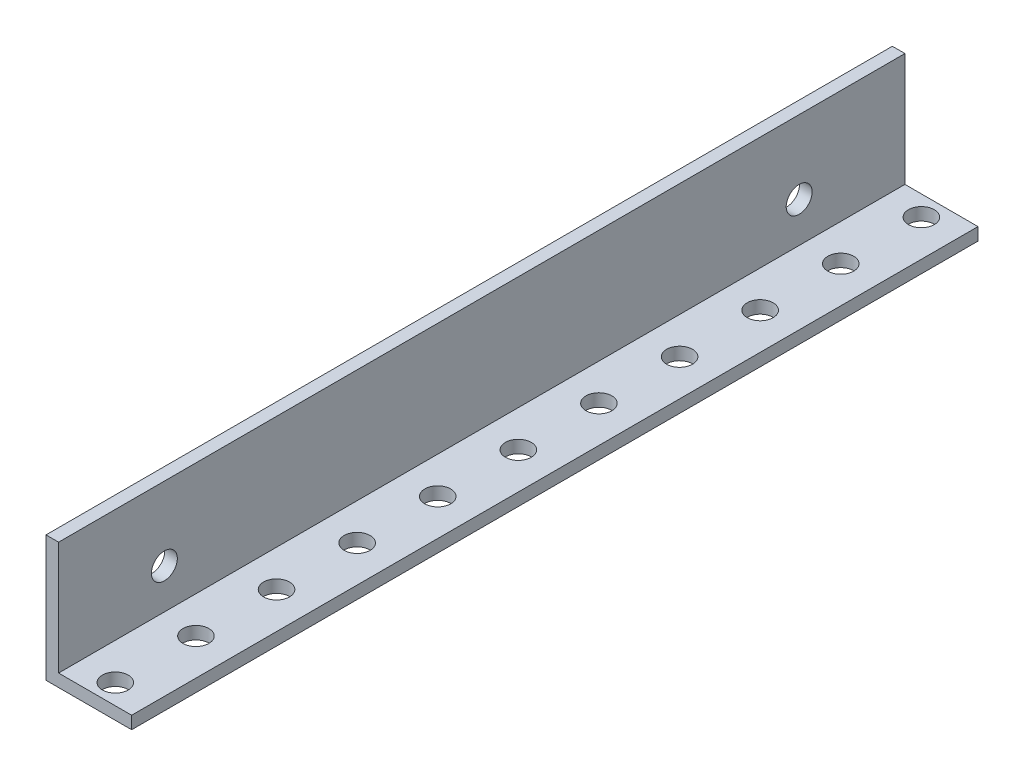
ISO-10303-21;
HEADER;
FILE_DESCRIPTION(('STEP AP214'),'2;1');
FILE_NAME('part.step','',(''),(''),'','','');
FILE_SCHEMA(('AUTOMOTIVE_DESIGN { 1 0 10303 214 1 1 1 1 }'));
ENDSEC;
DATA;
#1=APPLICATION_CONTEXT('core data for automotive mechanical design processes');
#2=APPLICATION_PROTOCOL_DEFINITION('international standard','automotive_design',2000,#1);
#3=PRODUCT_CONTEXT('',#1,'mechanical');
#4=PRODUCT('Part','Part','',(#3));
#5=PRODUCT_RELATED_PRODUCT_CATEGORY('part','',(#4));
#6=PRODUCT_DEFINITION_FORMATION('','',#4);
#7=PRODUCT_DEFINITION_CONTEXT('part definition',#1,'design');
#8=PRODUCT_DEFINITION('design','',#6,#7);
#9=PRODUCT_DEFINITION_SHAPE('','',#8);
#10=(LENGTH_UNIT() NAMED_UNIT(*) SI_UNIT(.MILLI.,.METRE.));
#11=(NAMED_UNIT(*) PLANE_ANGLE_UNIT() SI_UNIT($,.RADIAN.));
#12=(NAMED_UNIT(*) SI_UNIT($,.STERADIAN.) SOLID_ANGLE_UNIT());
#13=UNCERTAINTY_MEASURE_WITH_UNIT(LENGTH_MEASURE(1.E-05),#10,'distance_accuracy_value','');
#14=(GEOMETRIC_REPRESENTATION_CONTEXT(3) GLOBAL_UNCERTAINTY_ASSIGNED_CONTEXT((#13)) GLOBAL_UNIT_ASSIGNED_CONTEXT((#10,
#11,#12)) REPRESENTATION_CONTEXT('',''));
#15=CARTESIAN_POINT('',(0.,0.,0.));
#16=DIRECTION('',(0.,0.,1.));
#17=DIRECTION('',(1.,0.,0.));
#18=AXIS2_PLACEMENT_3D('',#15,#16,#17);
#19=CARTESIAN_POINT('',(1.5875,1.5875,53.34));
#20=DIRECTION('',(0.,-1.,0.));
#21=DIRECTION('',(1.,0.,0.));
#22=AXIS2_PLACEMENT_3D('',#19,#20,#21);
#23=PLANE('',#22);
#24=CARTESIAN_POINT('',(6.1976,1.5875,50.8));
#25=DIRECTION('',(0.,1.,0.));
#26=DIRECTION('',(0.,0.,1.));
#27=AXIS2_PLACEMENT_3D('',#24,#25,#26);
#28=CIRCLE('',#27,1.63194999999999);
#29=CARTESIAN_POINT('',(6.1976,1.5875,52.43195));
#30=VERTEX_POINT('',#29);
#31=EDGE_CURVE('E189',#30,#30,#28,.T.);
#32=ORIENTED_EDGE('',*,*,#31,.F.);
#33=EDGE_LOOP('',(#32));
#34=FACE_BOUND('',#33,.T.);
#35=CARTESIAN_POINT('',(6.1976,1.5875,40.64));
#36=DIRECTION('',(0.,1.,0.));
#37=DIRECTION('',(0.,0.,1.));
#38=AXIS2_PLACEMENT_3D('',#35,#36,#37);
#39=CIRCLE('',#38,1.63194999999999);
#40=CARTESIAN_POINT('',(6.1976,1.5875,42.27195));
#41=VERTEX_POINT('',#40);
#42=EDGE_CURVE('E199',#41,#41,#39,.T.);
#43=ORIENTED_EDGE('',*,*,#42,.F.);
#44=EDGE_LOOP('',(#43));
#45=FACE_BOUND('',#44,.T.);
#46=CARTESIAN_POINT('',(6.1976,1.5875,30.48));
#47=DIRECTION('',(0.,1.,0.));
#48=DIRECTION('',(0.,0.,1.));
#49=AXIS2_PLACEMENT_3D('',#46,#47,#48);
#50=CIRCLE('',#49,1.63194999999999);
#51=CARTESIAN_POINT('',(6.1976,1.5875,32.11195));
#52=VERTEX_POINT('',#51);
#53=EDGE_CURVE('E205',#52,#52,#50,.T.);
#54=ORIENTED_EDGE('',*,*,#53,.F.);
#55=EDGE_LOOP('',(#54));
#56=FACE_BOUND('',#55,.T.);
#57=CARTESIAN_POINT('',(6.1976,1.5875,20.32));
#58=DIRECTION('',(0.,1.,0.));
#59=DIRECTION('',(0.,0.,1.));
#60=AXIS2_PLACEMENT_3D('',#57,#58,#59);
#61=CIRCLE('',#60,1.63194999999999);
#62=CARTESIAN_POINT('',(6.1976,1.5875,21.95195));
#63=VERTEX_POINT('',#62);
#64=EDGE_CURVE('E211',#63,#63,#61,.T.);
#65=ORIENTED_EDGE('',*,*,#64,.F.);
#66=EDGE_LOOP('',(#65));
#67=FACE_BOUND('',#66,.T.);
#68=CARTESIAN_POINT('',(6.1976,1.5875,10.16));
#69=DIRECTION('',(0.,1.,0.));
#70=DIRECTION('',(0.,0.,1.));
#71=AXIS2_PLACEMENT_3D('',#68,#69,#70);
#72=CIRCLE('',#71,1.63194999999999);
#73=CARTESIAN_POINT('',(6.1976,1.5875,11.79195));
#74=VERTEX_POINT('',#73);
#75=EDGE_CURVE('E217',#74,#74,#72,.T.);
#76=ORIENTED_EDGE('',*,*,#75,.F.);
#77=EDGE_LOOP('',(#76));
#78=FACE_BOUND('',#77,.T.);
#79=CARTESIAN_POINT('',(6.1976,1.5875,-50.8));
#80=DIRECTION('',(0.,1.,0.));
#81=DIRECTION('',(0.,0.,1.));
#82=AXIS2_PLACEMENT_3D('',#79,#80,#81);
#83=CIRCLE('',#82,1.63194999999999);
#84=CARTESIAN_POINT('',(6.1976,1.5875,-49.16805));
#85=VERTEX_POINT('',#84);
#86=EDGE_CURVE('E223',#85,#85,#83,.T.);
#87=ORIENTED_EDGE('',*,*,#86,.F.);
#88=EDGE_LOOP('',(#87));
#89=FACE_BOUND('',#88,.T.);
#90=CARTESIAN_POINT('',(6.1976,1.5875,-40.64));
#91=DIRECTION('',(0.,1.,0.));
#92=DIRECTION('',(0.,0.,1.));
#93=AXIS2_PLACEMENT_3D('',#90,#91,#92);
#94=CIRCLE('',#93,1.63194999999999);
#95=CARTESIAN_POINT('',(6.1976,1.5875,-39.00805));
#96=VERTEX_POINT('',#95);
#97=EDGE_CURVE('E229',#96,#96,#94,.T.);
#98=ORIENTED_EDGE('',*,*,#97,.F.);
#99=EDGE_LOOP('',(#98));
#100=FACE_BOUND('',#99,.T.);
#101=DIRECTION('',(-1.,0.,0.));
#102=VECTOR('',#101,1.);
#103=CARTESIAN_POINT('',(1.5875,1.5875,-53.34));
#104=LINE('',#103,#102);
#105=CARTESIAN_POINT('',(10.795,1.5875,-53.34));
#106=VERTEX_POINT('',#105);
#107=CARTESIAN_POINT('',(1.5875,1.5875,-53.34));
#108=VERTEX_POINT('',#107);
#109=EDGE_CURVE('E128',#106,#108,#104,.T.);
#110=ORIENTED_EDGE('',*,*,#109,.T.);
#111=DIRECTION('',(0.,0.,-1.));
#112=VECTOR('',#111,1.);
#113=CARTESIAN_POINT('',(1.5875,1.5875,53.34));
#114=LINE('',#113,#112);
#115=CARTESIAN_POINT('',(1.5875,1.5875,53.34));
#116=VERTEX_POINT('',#115);
#117=EDGE_CURVE('E113',#116,#108,#114,.T.);
#118=ORIENTED_EDGE('',*,*,#117,.F.);
#119=DIRECTION('',(-1.,0.,0.));
#120=VECTOR('',#119,1.);
#121=CARTESIAN_POINT('',(1.5875,1.5875,53.34));
#122=LINE('',#121,#120);
#123=CARTESIAN_POINT('',(10.795,1.5875,53.34));
#124=VERTEX_POINT('',#123);
#125=EDGE_CURVE('E104',#124,#116,#122,.T.);
#126=ORIENTED_EDGE('',*,*,#125,.F.);
#127=DIRECTION('',(0.,0.,-1.));
#128=VECTOR('',#127,1.);
#129=CARTESIAN_POINT('',(10.795,1.5875,53.34));
#130=LINE('',#129,#128);
#131=EDGE_CURVE('E46',#124,#106,#130,.T.);
#132=ORIENTED_EDGE('',*,*,#131,.T.);
#133=EDGE_LOOP('',(#110,#118,#126,#132));
#134=FACE_BOUND('',#133,.T.);
#135=CARTESIAN_POINT('',(6.1976,1.5875,0.));
#136=DIRECTION('',(0.,1.,0.));
#137=DIRECTION('',(0.,0.,1.));
#138=AXIS2_PLACEMENT_3D('',#135,#136,#137);
#139=CIRCLE('',#138,1.63194999999999);
#140=CARTESIAN_POINT('',(6.1976,1.5875,1.63194999999999));
#141=VERTEX_POINT('',#140);
#142=EDGE_CURVE('E253',#141,#141,#139,.T.);
#143=ORIENTED_EDGE('',*,*,#142,.F.);
#144=EDGE_LOOP('',(#143));
#145=FACE_BOUND('',#144,.T.);
#146=CARTESIAN_POINT('',(6.1976,1.5875,-10.16));
#147=DIRECTION('',(0.,1.,0.));
#148=DIRECTION('',(0.,0.,1.));
#149=AXIS2_PLACEMENT_3D('',#146,#147,#148);
#150=CIRCLE('',#149,1.63194999999999);
#151=CARTESIAN_POINT('',(6.1976,1.5875,-8.52805000000001));
#152=VERTEX_POINT('',#151);
#153=EDGE_CURVE('E247',#152,#152,#150,.T.);
#154=ORIENTED_EDGE('',*,*,#153,.F.);
#155=EDGE_LOOP('',(#154));
#156=FACE_BOUND('',#155,.T.);
#157=CARTESIAN_POINT('',(6.1976,1.5875,-20.32));
#158=DIRECTION('',(0.,1.,0.));
#159=DIRECTION('',(0.,0.,1.));
#160=AXIS2_PLACEMENT_3D('',#157,#158,#159);
#161=CIRCLE('',#160,1.63194999999999);
#162=CARTESIAN_POINT('',(6.1976,1.5875,-18.68805));
#163=VERTEX_POINT('',#162);
#164=EDGE_CURVE('E241',#163,#163,#161,.T.);
#165=ORIENTED_EDGE('',*,*,#164,.F.);
#166=EDGE_LOOP('',(#165));
#167=FACE_BOUND('',#166,.T.);
#168=CARTESIAN_POINT('',(6.1976,1.5875,-30.48));
#169=DIRECTION('',(0.,1.,0.));
#170=DIRECTION('',(0.,0.,1.));
#171=AXIS2_PLACEMENT_3D('',#168,#169,#170);
#172=CIRCLE('',#171,1.63194999999999);
#173=CARTESIAN_POINT('',(6.1976,1.5875,-28.84805));
#174=VERTEX_POINT('',#173);
#175=EDGE_CURVE('E235',#174,#174,#172,.T.);
#176=ORIENTED_EDGE('',*,*,#175,.F.);
#177=EDGE_LOOP('',(#176));
#178=FACE_BOUND('',#177,.T.);
#179=ADVANCED_FACE('F37',(#34,#45,#56,#67,#78,#89,#100,#134,#145,#156,#167,#178),#23,.F.);
#180=CARTESIAN_POINT('',(10.795,0.,53.34));
#181=DIRECTION('',(0.,1.,0.));
#182=DIRECTION('',(-1.,0.,0.));
#183=AXIS2_PLACEMENT_3D('',#180,#181,#182);
#184=PLANE('',#183);
#185=CARTESIAN_POINT('',(6.1976,0.,50.8));
#186=DIRECTION('',(0.,1.,0.));
#187=DIRECTION('',(-1.,0.,0.));
#188=AXIS2_PLACEMENT_3D('',#185,#186,#187);
#189=CIRCLE('',#188,1.63194999999999);
#190=CARTESIAN_POINT('',(4.56565000000001,0.,50.8));
#191=VERTEX_POINT('',#190);
#192=EDGE_CURVE('E196',#191,#191,#189,.T.);
#193=ORIENTED_EDGE('',*,*,#192,.T.);
#194=EDGE_LOOP('',(#193));
#195=FACE_BOUND('',#194,.T.);
#196=CARTESIAN_POINT('',(6.1976,0.,40.64));
#197=DIRECTION('',(0.,1.,0.));
#198=DIRECTION('',(-1.,0.,0.));
#199=AXIS2_PLACEMENT_3D('',#196,#197,#198);
#200=CIRCLE('',#199,1.63194999999999);
#201=CARTESIAN_POINT('',(4.56565000000001,0.,40.64));
#202=VERTEX_POINT('',#201);
#203=EDGE_CURVE('E202',#202,#202,#200,.T.);
#204=ORIENTED_EDGE('',*,*,#203,.T.);
#205=EDGE_LOOP('',(#204));
#206=FACE_BOUND('',#205,.T.);
#207=CARTESIAN_POINT('',(6.1976,0.,30.48));
#208=DIRECTION('',(0.,1.,0.));
#209=DIRECTION('',(-1.,0.,0.));
#210=AXIS2_PLACEMENT_3D('',#207,#208,#209);
#211=CIRCLE('',#210,1.63194999999999);
#212=CARTESIAN_POINT('',(4.56565000000001,0.,30.48));
#213=VERTEX_POINT('',#212);
#214=EDGE_CURVE('E208',#213,#213,#211,.T.);
#215=ORIENTED_EDGE('',*,*,#214,.T.);
#216=EDGE_LOOP('',(#215));
#217=FACE_BOUND('',#216,.T.);
#218=CARTESIAN_POINT('',(6.1976,0.,20.32));
#219=DIRECTION('',(0.,1.,0.));
#220=DIRECTION('',(-1.,0.,0.));
#221=AXIS2_PLACEMENT_3D('',#218,#219,#220);
#222=CIRCLE('',#221,1.63194999999999);
#223=CARTESIAN_POINT('',(4.56565000000001,0.,20.32));
#224=VERTEX_POINT('',#223);
#225=EDGE_CURVE('E214',#224,#224,#222,.T.);
#226=ORIENTED_EDGE('',*,*,#225,.T.);
#227=EDGE_LOOP('',(#226));
#228=FACE_BOUND('',#227,.T.);
#229=CARTESIAN_POINT('',(6.1976,0.,10.16));
#230=DIRECTION('',(0.,1.,0.));
#231=DIRECTION('',(-1.,0.,0.));
#232=AXIS2_PLACEMENT_3D('',#229,#230,#231);
#233=CIRCLE('',#232,1.63194999999999);
#234=CARTESIAN_POINT('',(4.56565000000001,0.,10.16));
#235=VERTEX_POINT('',#234);
#236=EDGE_CURVE('E220',#235,#235,#233,.T.);
#237=ORIENTED_EDGE('',*,*,#236,.T.);
#238=EDGE_LOOP('',(#237));
#239=FACE_BOUND('',#238,.T.);
#240=CARTESIAN_POINT('',(6.1976,0.,-50.8));
#241=DIRECTION('',(0.,1.,0.));
#242=DIRECTION('',(-1.,0.,0.));
#243=AXIS2_PLACEMENT_3D('',#240,#241,#242);
#244=CIRCLE('',#243,1.63194999999999);
#245=CARTESIAN_POINT('',(4.56565000000001,0.,-50.8));
#246=VERTEX_POINT('',#245);
#247=EDGE_CURVE('E226',#246,#246,#244,.T.);
#248=ORIENTED_EDGE('',*,*,#247,.T.);
#249=EDGE_LOOP('',(#248));
#250=FACE_BOUND('',#249,.T.);
#251=CARTESIAN_POINT('',(6.1976,0.,-40.64));
#252=DIRECTION('',(0.,1.,0.));
#253=DIRECTION('',(-1.,0.,0.));
#254=AXIS2_PLACEMENT_3D('',#251,#252,#253);
#255=CIRCLE('',#254,1.63194999999999);
#256=CARTESIAN_POINT('',(4.56565000000001,0.,-40.64));
#257=VERTEX_POINT('',#256);
#258=EDGE_CURVE('E232',#257,#257,#255,.T.);
#259=ORIENTED_EDGE('',*,*,#258,.T.);
#260=EDGE_LOOP('',(#259));
#261=FACE_BOUND('',#260,.T.);
#262=CARTESIAN_POINT('',(6.1976,0.,-30.48));
#263=DIRECTION('',(0.,1.,0.));
#264=DIRECTION('',(-1.,0.,0.));
#265=AXIS2_PLACEMENT_3D('',#262,#263,#264);
#266=CIRCLE('',#265,1.63194999999999);
#267=CARTESIAN_POINT('',(4.56565000000001,0.,-30.48));
#268=VERTEX_POINT('',#267);
#269=EDGE_CURVE('E238',#268,#268,#266,.T.);
#270=ORIENTED_EDGE('',*,*,#269,.T.);
#271=EDGE_LOOP('',(#270));
#272=FACE_BOUND('',#271,.T.);
#273=CARTESIAN_POINT('',(6.1976,0.,-20.32));
#274=DIRECTION('',(0.,1.,0.));
#275=DIRECTION('',(-1.,0.,0.));
#276=AXIS2_PLACEMENT_3D('',#273,#274,#275);
#277=CIRCLE('',#276,1.63194999999999);
#278=CARTESIAN_POINT('',(4.56565000000001,0.,-20.32));
#279=VERTEX_POINT('',#278);
#280=EDGE_CURVE('E244',#279,#279,#277,.T.);
#281=ORIENTED_EDGE('',*,*,#280,.T.);
#282=EDGE_LOOP('',(#281));
#283=FACE_BOUND('',#282,.T.);
#284=CARTESIAN_POINT('',(6.1976,0.,-10.16));
#285=DIRECTION('',(0.,1.,0.));
#286=DIRECTION('',(-1.,0.,0.));
#287=AXIS2_PLACEMENT_3D('',#284,#285,#286);
#288=CIRCLE('',#287,1.63194999999999);
#289=CARTESIAN_POINT('',(4.56565000000001,0.,-10.16));
#290=VERTEX_POINT('',#289);
#291=EDGE_CURVE('E250',#290,#290,#288,.T.);
#292=ORIENTED_EDGE('',*,*,#291,.T.);
#293=EDGE_LOOP('',(#292));
#294=FACE_BOUND('',#293,.T.);
#295=CARTESIAN_POINT('',(6.1976,0.,0.));
#296=DIRECTION('',(0.,1.,0.));
#297=DIRECTION('',(-1.,0.,0.));
#298=AXIS2_PLACEMENT_3D('',#295,#296,#297);
#299=CIRCLE('',#298,1.63194999999999);
#300=CARTESIAN_POINT('',(4.56565000000001,0.,0.));
#301=VERTEX_POINT('',#300);
#302=EDGE_CURVE('E126',#301,#301,#299,.T.);
#303=ORIENTED_EDGE('',*,*,#302,.T.);
#304=EDGE_LOOP('',(#303));
#305=FACE_BOUND('',#304,.T.);
#306=DIRECTION('',(1.,0.,0.));
#307=VECTOR('',#306,1.);
#308=CARTESIAN_POINT('',(10.795,0.,-53.34));
#309=LINE('',#308,#307);
#310=CARTESIAN_POINT('',(0.,0.,-53.34));
#311=VERTEX_POINT('',#310);
#312=CARTESIAN_POINT('',(10.795,0.,-53.34));
#313=VERTEX_POINT('',#312);
#314=EDGE_CURVE('E122',#311,#313,#309,.T.);
#315=ORIENTED_EDGE('',*,*,#314,.T.);
#316=DIRECTION('',(0.,0.,-1.));
#317=VECTOR('',#316,1.);
#318=CARTESIAN_POINT('',(10.795,0.,53.34));
#319=LINE('',#318,#317);
#320=CARTESIAN_POINT('',(10.795,0.,53.34));
#321=VERTEX_POINT('',#320);
#322=EDGE_CURVE('E11',#321,#313,#319,.T.);
#323=ORIENTED_EDGE('',*,*,#322,.F.);
#324=DIRECTION('',(1.,0.,0.));
#325=VECTOR('',#324,1.);
#326=CARTESIAN_POINT('',(10.795,0.,53.34));
#327=LINE('',#326,#325);
#328=CARTESIAN_POINT('',(0.,0.,53.34));
#329=VERTEX_POINT('',#328);
#330=EDGE_CURVE('E133',#329,#321,#327,.T.);
#331=ORIENTED_EDGE('',*,*,#330,.F.);
#332=DIRECTION('',(0.,0.,-1.));
#333=VECTOR('',#332,1.);
#334=CARTESIAN_POINT('',(0.,0.,53.34));
#335=LINE('',#334,#333);
#336=EDGE_CURVE('E118',#329,#311,#335,.T.);
#337=ORIENTED_EDGE('',*,*,#336,.T.);
#338=EDGE_LOOP('',(#315,#323,#331,#337));
#339=FACE_BOUND('',#338,.T.);
#340=ADVANCED_FACE('F39',(#195,#206,#217,#228,#239,#250,#261,#272,#283,#294,#305,#339),#184,.F.);
#341=CARTESIAN_POINT('',(10.795,1.5875,53.34));
#342=DIRECTION('',(-1.,0.,0.));
#343=DIRECTION('',(0.,0.,1.));
#344=AXIS2_PLACEMENT_3D('',#341,#342,#343);
#345=PLANE('',#344);
#346=DIRECTION('',(0.,1.,0.));
#347=VECTOR('',#346,1.);
#348=CARTESIAN_POINT('',(10.795,1.5875,-53.34));
#349=LINE('',#348,#347);
#350=EDGE_CURVE('E125',#313,#106,#349,.T.);
#351=ORIENTED_EDGE('',*,*,#350,.T.);
#352=ORIENTED_EDGE('',*,*,#131,.F.);
#353=DIRECTION('',(0.,1.,0.));
#354=VECTOR('',#353,1.);
#355=CARTESIAN_POINT('',(10.795,1.5875,53.34));
#356=LINE('',#355,#354);
#357=EDGE_CURVE('E91',#321,#124,#356,.T.);
#358=ORIENTED_EDGE('',*,*,#357,.F.);
#359=ORIENTED_EDGE('',*,*,#322,.T.);
#360=EDGE_LOOP('',(#351,#352,#358,#359));
#361=FACE_BOUND('',#360,.T.);
#362=ADVANCED_FACE('F165',(#361),#345,.F.);
#363=CARTESIAN_POINT('',(1.5875,15.875,53.34));
#364=DIRECTION('',(-1.,0.,0.));
#365=DIRECTION('',(0.,-1.,0.));
#366=AXIS2_PLACEMENT_3D('',#363,#364,#365);
#367=PLANE('',#366);
#368=CARTESIAN_POINT('',(1.5875,6.62178,-40.005));
#369=DIRECTION('',(1.,0.,0.));
#370=DIRECTION('',(0.,0.,-1.));
#371=AXIS2_PLACEMENT_3D('',#368,#369,#370);
#372=CIRCLE('',#371,1.63194999999999);
#373=CARTESIAN_POINT('',(1.5875,6.62178,-41.63695));
#374=VERTEX_POINT('',#373);
#375=EDGE_CURVE('E180',#374,#374,#372,.T.);
#376=ORIENTED_EDGE('',*,*,#375,.F.);
#377=EDGE_LOOP('',(#376));
#378=FACE_BOUND('',#377,.T.);
#379=CARTESIAN_POINT('',(1.5875,6.62177999999999,40.005));
#380=DIRECTION('',(1.,0.,0.));
#381=DIRECTION('',(0.,0.,-1.));
#382=AXIS2_PLACEMENT_3D('',#379,#380,#381);
#383=CIRCLE('',#382,1.63194999999999);
#384=CARTESIAN_POINT('',(1.5875,6.62177999999999,38.37305));
#385=VERTEX_POINT('',#384);
#386=EDGE_CURVE('E183',#385,#385,#383,.T.);
#387=ORIENTED_EDGE('',*,*,#386,.F.);
#388=EDGE_LOOP('',(#387));
#389=FACE_BOUND('',#388,.T.);
#390=DIRECTION('',(0.,1.,0.));
#391=VECTOR('',#390,1.);
#392=CARTESIAN_POINT('',(1.5875,15.875,-53.34));
#393=LINE('',#392,#391);
#394=CARTESIAN_POINT('',(1.5875,15.875,-53.34));
#395=VERTEX_POINT('',#394);
#396=EDGE_CURVE('E112',#108,#395,#393,.T.);
#397=ORIENTED_EDGE('',*,*,#396,.T.);
#398=DIRECTION('',(0.,0.,-1.));
#399=VECTOR('',#398,1.);
#400=CARTESIAN_POINT('',(1.5875,15.875,53.34));
#401=LINE('',#400,#399);
#402=CARTESIAN_POINT('',(1.5875,15.875,53.34));
#403=VERTEX_POINT('',#402);
#404=EDGE_CURVE('E109',#403,#395,#401,.T.);
#405=ORIENTED_EDGE('',*,*,#404,.F.);
#406=DIRECTION('',(0.,1.,0.));
#407=VECTOR('',#406,1.);
#408=CARTESIAN_POINT('',(1.5875,15.875,53.34));
#409=LINE('',#408,#407);
#410=EDGE_CURVE('E98',#116,#403,#409,.T.);
#411=ORIENTED_EDGE('',*,*,#410,.F.);
#412=ORIENTED_EDGE('',*,*,#117,.T.);
#413=EDGE_LOOP('',(#397,#405,#411,#412));
#414=FACE_BOUND('',#413,.T.);
#415=ADVANCED_FACE('F110',(#378,#389,#414),#367,.F.);
#416=CARTESIAN_POINT('',(0.,15.875,53.34));
#417=DIRECTION('',(0.,-1.,0.));
#418=DIRECTION('',(0.,0.,-1.));
#419=AXIS2_PLACEMENT_3D('',#416,#417,#418);
#420=PLANE('',#419);
#421=DIRECTION('',(-1.,0.,0.));
#422=VECTOR('',#421,1.);
#423=CARTESIAN_POINT('',(0.,15.875,-53.34));
#424=LINE('',#423,#422);
#425=CARTESIAN_POINT('',(0.,15.875,-53.34));
#426=VERTEX_POINT('',#425);
#427=EDGE_CURVE('E77',#395,#426,#424,.T.);
#428=ORIENTED_EDGE('',*,*,#427,.T.);
#429=DIRECTION('',(0.,0.,-1.));
#430=VECTOR('',#429,1.);
#431=CARTESIAN_POINT('',(0.,15.875,53.34));
#432=LINE('',#431,#430);
#433=CARTESIAN_POINT('',(0.,15.875,53.34));
#434=VERTEX_POINT('',#433);
#435=EDGE_CURVE('E114',#434,#426,#432,.T.);
#436=ORIENTED_EDGE('',*,*,#435,.F.);
#437=DIRECTION('',(-1.,0.,0.));
#438=VECTOR('',#437,1.);
#439=CARTESIAN_POINT('',(0.,15.875,53.34));
#440=LINE('',#439,#438);
#441=EDGE_CURVE('E102',#403,#434,#440,.T.);
#442=ORIENTED_EDGE('',*,*,#441,.F.);
#443=ORIENTED_EDGE('',*,*,#404,.T.);
#444=EDGE_LOOP('',(#428,#436,#442,#443));
#445=FACE_BOUND('',#444,.T.);
#446=ADVANCED_FACE('F116',(#445),#420,.F.);
#447=CARTESIAN_POINT('',(0.,0.,53.34));
#448=DIRECTION('',(1.,0.,0.));
#449=DIRECTION('',(0.,0.,-1.));
#450=AXIS2_PLACEMENT_3D('',#447,#448,#449);
#451=PLANE('',#450);
#452=CARTESIAN_POINT('',(0.,6.62178,-40.005));
#453=DIRECTION('',(1.,0.,0.));
#454=DIRECTION('',(0.,0.,-1.));
#455=AXIS2_PLACEMENT_3D('',#452,#453,#454);
#456=CIRCLE('',#455,1.63194999999999);
#457=CARTESIAN_POINT('',(0.,6.62178,-41.63695));
#458=VERTEX_POINT('',#457);
#459=EDGE_CURVE('E186',#458,#458,#456,.T.);
#460=ORIENTED_EDGE('',*,*,#459,.T.);
#461=EDGE_LOOP('',(#460));
#462=FACE_BOUND('',#461,.T.);
#463=CARTESIAN_POINT('',(0.,6.62177999999999,40.005));
#464=DIRECTION('',(1.,0.,0.));
#465=DIRECTION('',(0.,0.,-1.));
#466=AXIS2_PLACEMENT_3D('',#463,#464,#465);
#467=CIRCLE('',#466,1.63194999999999);
#468=CARTESIAN_POINT('',(0.,6.62177999999999,38.37305));
#469=VERTEX_POINT('',#468);
#470=EDGE_CURVE('E185',#469,#469,#467,.T.);
#471=ORIENTED_EDGE('',*,*,#470,.T.);
#472=EDGE_LOOP('',(#471));
#473=FACE_BOUND('',#472,.T.);
#474=DIRECTION('',(0.,-1.,0.));
#475=VECTOR('',#474,1.);
#476=CARTESIAN_POINT('',(0.,0.,-53.34));
#477=LINE('',#476,#475);
#478=EDGE_CURVE('E83',#426,#311,#477,.T.);
#479=ORIENTED_EDGE('',*,*,#478,.T.);
#480=ORIENTED_EDGE('',*,*,#336,.F.);
#481=DIRECTION('',(0.,-1.,0.));
#482=VECTOR('',#481,1.);
#483=CARTESIAN_POINT('',(0.,0.,53.34));
#484=LINE('',#483,#482);
#485=EDGE_CURVE('E54',#434,#329,#484,.T.);
#486=ORIENTED_EDGE('',*,*,#485,.F.);
#487=ORIENTED_EDGE('',*,*,#435,.T.);
#488=EDGE_LOOP('',(#479,#480,#486,#487));
#489=FACE_BOUND('',#488,.T.);
#490=ADVANCED_FACE('F146',(#462,#473,#489),#451,.F.);
#491=CARTESIAN_POINT('',(0.,0.,53.34));
#492=DIRECTION('',(0.,0.,-1.));
#493=DIRECTION('',(-1.,0.,0.));
#494=AXIS2_PLACEMENT_3D('',#491,#492,#493);
#495=PLANE('',#494);
#496=ORIENTED_EDGE('',*,*,#330,.T.);
#497=ORIENTED_EDGE('',*,*,#357,.T.);
#498=ORIENTED_EDGE('',*,*,#125,.T.);
#499=ORIENTED_EDGE('',*,*,#410,.T.);
#500=ORIENTED_EDGE('',*,*,#441,.T.);
#501=ORIENTED_EDGE('',*,*,#485,.T.);
#502=EDGE_LOOP('',(#496,#497,#498,#499,#500,#501));
#503=FACE_BOUND('',#502,.T.);
#504=ADVANCED_FACE('F100',(#503),#495,.F.);
#505=CARTESIAN_POINT('',(0.,0.,-53.34));
#506=DIRECTION('',(0.,0.,-1.));
#507=DIRECTION('',(-1.,0.,0.));
#508=AXIS2_PLACEMENT_3D('',#505,#506,#507);
#509=PLANE('',#508);
#510=ORIENTED_EDGE('',*,*,#314,.F.);
#511=ORIENTED_EDGE('',*,*,#478,.F.);
#512=ORIENTED_EDGE('',*,*,#427,.F.);
#513=ORIENTED_EDGE('',*,*,#396,.F.);
#514=ORIENTED_EDGE('',*,*,#109,.F.);
#515=ORIENTED_EDGE('',*,*,#350,.F.);
#516=EDGE_LOOP('',(#510,#511,#512,#513,#514,#515));
#517=FACE_BOUND('',#516,.T.);
#518=ADVANCED_FACE('F142',(#517),#509,.T.);
#519=CARTESIAN_POINT('',(6.1976,1.5875,0.));
#520=DIRECTION('',(0.,1.,0.));
#521=DIRECTION('',(0.,0.,1.));
#522=AXIS2_PLACEMENT_3D('',#519,#520,#521);
#523=CYLINDRICAL_SURFACE('',#522,1.63194999999999);
#524=ORIENTED_EDGE('',*,*,#142,.T.);
#525=EDGE_LOOP('',(#524));
#526=FACE_BOUND('',#525,.T.);
#527=ORIENTED_EDGE('',*,*,#302,.F.);
#528=EDGE_LOOP('',(#527));
#529=FACE_BOUND('',#528,.T.);
#530=ADVANCED_FACE('F262',(#526,#529),#523,.F.);
#531=CARTESIAN_POINT('',(6.1976,1.5875,-10.16));
#532=DIRECTION('',(0.,1.,0.));
#533=DIRECTION('',(0.,0.,1.));
#534=AXIS2_PLACEMENT_3D('',#531,#532,#533);
#535=CYLINDRICAL_SURFACE('',#534,1.63194999999999);
#536=ORIENTED_EDGE('',*,*,#153,.T.);
#537=EDGE_LOOP('',(#536));
#538=FACE_BOUND('',#537,.T.);
#539=ORIENTED_EDGE('',*,*,#291,.F.);
#540=EDGE_LOOP('',(#539));
#541=FACE_BOUND('',#540,.T.);
#542=ADVANCED_FACE('F264',(#538,#541),#535,.F.);
#543=CARTESIAN_POINT('',(6.1976,1.5875,-20.32));
#544=DIRECTION('',(0.,1.,0.));
#545=DIRECTION('',(0.,0.,1.));
#546=AXIS2_PLACEMENT_3D('',#543,#544,#545);
#547=CYLINDRICAL_SURFACE('',#546,1.63194999999999);
#548=ORIENTED_EDGE('',*,*,#164,.T.);
#549=EDGE_LOOP('',(#548));
#550=FACE_BOUND('',#549,.T.);
#551=ORIENTED_EDGE('',*,*,#280,.F.);
#552=EDGE_LOOP('',(#551));
#553=FACE_BOUND('',#552,.T.);
#554=ADVANCED_FACE('F271',(#550,#553),#547,.F.);
#555=CARTESIAN_POINT('',(6.1976,1.5875,-30.48));
#556=DIRECTION('',(0.,1.,0.));
#557=DIRECTION('',(0.,0.,1.));
#558=AXIS2_PLACEMENT_3D('',#555,#556,#557);
#559=CYLINDRICAL_SURFACE('',#558,1.63194999999999);
#560=ORIENTED_EDGE('',*,*,#175,.T.);
#561=EDGE_LOOP('',(#560));
#562=FACE_BOUND('',#561,.T.);
#563=ORIENTED_EDGE('',*,*,#269,.F.);
#564=EDGE_LOOP('',(#563));
#565=FACE_BOUND('',#564,.T.);
#566=ADVANCED_FACE('F277',(#562,#565),#559,.F.);
#567=CARTESIAN_POINT('',(6.1976,1.5875,-40.64));
#568=DIRECTION('',(0.,1.,0.));
#569=DIRECTION('',(0.,0.,1.));
#570=AXIS2_PLACEMENT_3D('',#567,#568,#569);
#571=CYLINDRICAL_SURFACE('',#570,1.63194999999999);
#572=ORIENTED_EDGE('',*,*,#97,.T.);
#573=EDGE_LOOP('',(#572));
#574=FACE_BOUND('',#573,.T.);
#575=ORIENTED_EDGE('',*,*,#258,.F.);
#576=EDGE_LOOP('',(#575));
#577=FACE_BOUND('',#576,.T.);
#578=ADVANCED_FACE('F281',(#574,#577),#571,.F.);
#579=CARTESIAN_POINT('',(6.1976,1.5875,-50.8));
#580=DIRECTION('',(0.,1.,0.));
#581=DIRECTION('',(0.,0.,1.));
#582=AXIS2_PLACEMENT_3D('',#579,#580,#581);
#583=CYLINDRICAL_SURFACE('',#582,1.63194999999999);
#584=ORIENTED_EDGE('',*,*,#86,.T.);
#585=EDGE_LOOP('',(#584));
#586=FACE_BOUND('',#585,.T.);
#587=ORIENTED_EDGE('',*,*,#247,.F.);
#588=EDGE_LOOP('',(#587));
#589=FACE_BOUND('',#588,.T.);
#590=ADVANCED_FACE('F285',(#586,#589),#583,.F.);
#591=CARTESIAN_POINT('',(6.1976,1.5875,10.16));
#592=DIRECTION('',(0.,1.,0.));
#593=DIRECTION('',(0.,0.,1.));
#594=AXIS2_PLACEMENT_3D('',#591,#592,#593);
#595=CYLINDRICAL_SURFACE('',#594,1.63194999999999);
#596=ORIENTED_EDGE('',*,*,#75,.T.);
#597=EDGE_LOOP('',(#596));
#598=FACE_BOUND('',#597,.T.);
#599=ORIENTED_EDGE('',*,*,#236,.F.);
#600=EDGE_LOOP('',(#599));
#601=FACE_BOUND('',#600,.T.);
#602=ADVANCED_FACE('F289',(#598,#601),#595,.F.);
#603=CARTESIAN_POINT('',(6.1976,1.5875,20.32));
#604=DIRECTION('',(0.,1.,0.));
#605=DIRECTION('',(0.,0.,1.));
#606=AXIS2_PLACEMENT_3D('',#603,#604,#605);
#607=CYLINDRICAL_SURFACE('',#606,1.63194999999999);
#608=ORIENTED_EDGE('',*,*,#64,.T.);
#609=EDGE_LOOP('',(#608));
#610=FACE_BOUND('',#609,.T.);
#611=ORIENTED_EDGE('',*,*,#225,.F.);
#612=EDGE_LOOP('',(#611));
#613=FACE_BOUND('',#612,.T.);
#614=ADVANCED_FACE('F293',(#610,#613),#607,.F.);
#615=CARTESIAN_POINT('',(6.1976,1.5875,30.48));
#616=DIRECTION('',(0.,1.,0.));
#617=DIRECTION('',(0.,0.,1.));
#618=AXIS2_PLACEMENT_3D('',#615,#616,#617);
#619=CYLINDRICAL_SURFACE('',#618,1.63194999999999);
#620=ORIENTED_EDGE('',*,*,#53,.T.);
#621=EDGE_LOOP('',(#620));
#622=FACE_BOUND('',#621,.T.);
#623=ORIENTED_EDGE('',*,*,#214,.F.);
#624=EDGE_LOOP('',(#623));
#625=FACE_BOUND('',#624,.T.);
#626=ADVANCED_FACE('F297',(#622,#625),#619,.F.);
#627=CARTESIAN_POINT('',(6.1976,1.5875,40.64));
#628=DIRECTION('',(0.,1.,0.));
#629=DIRECTION('',(0.,0.,1.));
#630=AXIS2_PLACEMENT_3D('',#627,#628,#629);
#631=CYLINDRICAL_SURFACE('',#630,1.63194999999999);
#632=ORIENTED_EDGE('',*,*,#42,.T.);
#633=EDGE_LOOP('',(#632));
#634=FACE_BOUND('',#633,.T.);
#635=ORIENTED_EDGE('',*,*,#203,.F.);
#636=EDGE_LOOP('',(#635));
#637=FACE_BOUND('',#636,.T.);
#638=ADVANCED_FACE('F301',(#634,#637),#631,.F.);
#639=CARTESIAN_POINT('',(6.1976,1.5875,50.8));
#640=DIRECTION('',(0.,1.,0.));
#641=DIRECTION('',(0.,0.,1.));
#642=AXIS2_PLACEMENT_3D('',#639,#640,#641);
#643=CYLINDRICAL_SURFACE('',#642,1.63194999999999);
#644=ORIENTED_EDGE('',*,*,#31,.T.);
#645=EDGE_LOOP('',(#644));
#646=FACE_BOUND('',#645,.T.);
#647=ORIENTED_EDGE('',*,*,#192,.F.);
#648=EDGE_LOOP('',(#647));
#649=FACE_BOUND('',#648,.T.);
#650=ADVANCED_FACE('F305',(#646,#649),#643,.F.);
#651=CARTESIAN_POINT('',(1.5875,6.62177999999999,40.005));
#652=DIRECTION('',(1.,0.,0.));
#653=DIRECTION('',(0.,0.,-1.));
#654=AXIS2_PLACEMENT_3D('',#651,#652,#653);
#655=CYLINDRICAL_SURFACE('',#654,1.63194999999999);
#656=ORIENTED_EDGE('',*,*,#386,.T.);
#657=EDGE_LOOP('',(#656));
#658=FACE_BOUND('',#657,.T.);
#659=ORIENTED_EDGE('',*,*,#470,.F.);
#660=EDGE_LOOP('',(#659));
#661=FACE_BOUND('',#660,.T.);
#662=ADVANCED_FACE('F309',(#658,#661),#655,.F.);
#663=CARTESIAN_POINT('',(1.5875,6.62178,-40.005));
#664=DIRECTION('',(1.,0.,0.));
#665=DIRECTION('',(0.,0.,-1.));
#666=AXIS2_PLACEMENT_3D('',#663,#664,#665);
#667=CYLINDRICAL_SURFACE('',#666,1.63194999999999);
#668=ORIENTED_EDGE('',*,*,#375,.T.);
#669=EDGE_LOOP('',(#668));
#670=FACE_BOUND('',#669,.T.);
#671=ORIENTED_EDGE('',*,*,#459,.F.);
#672=EDGE_LOOP('',(#671));
#673=FACE_BOUND('',#672,.T.);
#674=ADVANCED_FACE('F313',(#670,#673),#667,.F.);
#675=CLOSED_SHELL('',(#179,#340,#362,#415,#446,#490,#504,#518,#530,#542,#554,#566,#578,#590,
#602,#614,#626,#638,#650,#662,#674));
#676=MANIFOLD_SOLID_BREP('B2',#675);
#677=ADVANCED_BREP_SHAPE_REPRESENTATION('',(#18,#676),#14);
#678=SHAPE_DEFINITION_REPRESENTATION(#9,#677);
ENDSEC;
END-ISO-10303-21;
